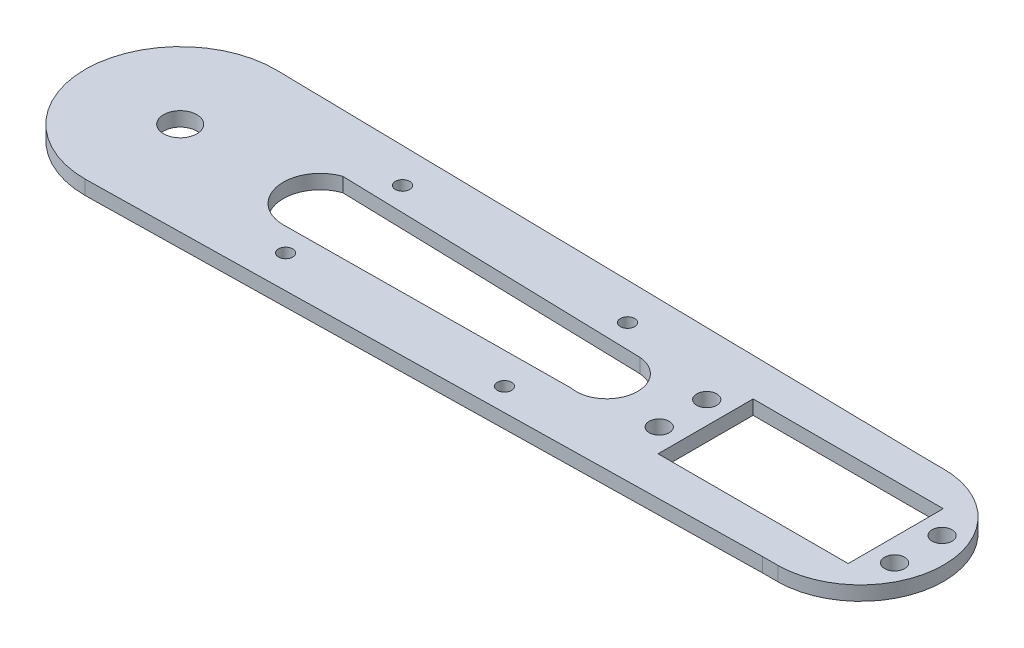
ISO-10303-21;
HEADER;
FILE_DESCRIPTION(('STEP AP214'),'2;1');
FILE_NAME('part.step','',(''),(''),'','','');
FILE_SCHEMA(('AUTOMOTIVE_DESIGN { 1 0 10303 214 1 1 1 1 }'));
ENDSEC;
DATA;
#1=APPLICATION_CONTEXT('core data for automotive mechanical design processes');
#2=APPLICATION_PROTOCOL_DEFINITION('international standard','automotive_design',2000,#1);
#3=PRODUCT_CONTEXT('',#1,'mechanical');
#4=PRODUCT('Part','Part','',(#3));
#5=PRODUCT_RELATED_PRODUCT_CATEGORY('part','',(#4));
#6=PRODUCT_DEFINITION_FORMATION('','',#4);
#7=PRODUCT_DEFINITION_CONTEXT('part definition',#1,'design');
#8=PRODUCT_DEFINITION('design','',#6,#7);
#9=PRODUCT_DEFINITION_SHAPE('','',#8);
#10=(LENGTH_UNIT() NAMED_UNIT(*) SI_UNIT(.MILLI.,.METRE.));
#11=(NAMED_UNIT(*) PLANE_ANGLE_UNIT() SI_UNIT($,.RADIAN.));
#12=(NAMED_UNIT(*) SI_UNIT($,.STERADIAN.) SOLID_ANGLE_UNIT());
#13=UNCERTAINTY_MEASURE_WITH_UNIT(LENGTH_MEASURE(1.E-05),#10,'distance_accuracy_value','');
#14=(GEOMETRIC_REPRESENTATION_CONTEXT(3) GLOBAL_UNCERTAINTY_ASSIGNED_CONTEXT((#13)) GLOBAL_UNIT_ASSIGNED_CONTEXT((#10,
#11,#12)) REPRESENTATION_CONTEXT('',''));
#15=CARTESIAN_POINT('',(0.,0.,0.));
#16=DIRECTION('',(0.,0.,1.));
#17=DIRECTION('',(1.,0.,0.));
#18=AXIS2_PLACEMENT_3D('',#15,#16,#17);
#19=CARTESIAN_POINT('',(0.,3.,0.));
#20=DIRECTION('',(0.,1.,0.));
#21=DIRECTION('',(0.,0.,1.));
#22=AXIS2_PLACEMENT_3D('',#19,#20,#21);
#23=PLANE('',#22);
#24=CARTESIAN_POINT('',(155.08,3.,4.77806502659532));
#25=DIRECTION('',(0.,1.,0.));
#26=DIRECTION('',(0.,0.,1.));
#27=AXIS2_PLACEMENT_3D('',#24,#25,#26);
#28=CIRCLE('',#27,2.09999999999999);
#29=CARTESIAN_POINT('',(155.08,3.,6.87806502659531));
#30=VERTEX_POINT('',#29);
#31=EDGE_CURVE('E360',#30,#30,#28,.T.);
#32=ORIENTED_EDGE('',*,*,#31,.F.);
#33=EDGE_LOOP('',(#32));
#34=FACE_BOUND('',#33,.T.);
#35=CARTESIAN_POINT('',(155.08,3.,-5.22193497340468));
#36=DIRECTION('',(0.,1.,0.));
#37=DIRECTION('',(0.,0.,1.));
#38=AXIS2_PLACEMENT_3D('',#35,#36,#37);
#39=CIRCLE('',#38,2.09999999999999);
#40=CARTESIAN_POINT('',(155.08,3.,-3.12193497340469));
#41=VERTEX_POINT('',#40);
#42=EDGE_CURVE('E364',#41,#41,#39,.T.);
#43=ORIENTED_EDGE('',*,*,#42,.F.);
#44=EDGE_LOOP('',(#43));
#45=FACE_BOUND('',#44,.T.);
#46=DIRECTION('',(-0.999840599345445,0.,0.0178542964168829));
#47=VECTOR('',#46,1.);
#48=CARTESIAN_POINT('',(0.357029008606949,3.,19.9936244819892));
#49=LINE('',#48,#47);
#50=CARTESIAN_POINT('',(140.,3.,17.5));
#51=VERTEX_POINT('',#50);
#52=CARTESIAN_POINT('',(0.,3.,20.));
#53=VERTEX_POINT('',#52);
#54=EDGE_CURVE('E187',#51,#53,#49,.T.);
#55=ORIENTED_EDGE('',*,*,#54,.F.);
#56=DIRECTION('',(-1.,0.,0.));
#57=VECTOR('',#56,1.);
#58=CARTESIAN_POINT('',(0.,3.,17.5000000000002));
#59=LINE('',#58,#57);
#60=CARTESIAN_POINT('',(143.30110747715,3.,17.5));
#61=VERTEX_POINT('',#60);
#62=EDGE_CURVE('E175',#61,#51,#59,.T.);
#63=ORIENTED_EDGE('',*,*,#62,.F.);
#64=CARTESIAN_POINT('',(143.13337203176,3.,0.000803880738995593));
#65=DIRECTION('',(0.,1.,0.));
#66=DIRECTION('',(0.,0.,1.));
#67=AXIS2_PLACEMENT_3D('',#64,#65,#66);
#68=CIRCLE('',#67,17.5);
#69=CARTESIAN_POINT('',(142.869697489549,3.,-17.4972095989618));
#70=VERTEX_POINT('',#69);
#71=EDGE_CURVE('E713',#70,#61,#68,.F.);
#72=ORIENTED_EDGE('',*,*,#71,.F.);
#73=DIRECTION('',(1.,0.,0.));
#74=VECTOR('',#73,1.);
#75=CARTESIAN_POINT('',(0.,3.,-17.4972095989618));
#76=LINE('',#75,#74);
#77=CARTESIAN_POINT('',(140.3125,3.,-17.4972095989618));
#78=VERTEX_POINT('',#77);
#79=EDGE_CURVE('E170',#78,#70,#76,.T.);
#80=ORIENTED_EDGE('',*,*,#79,.F.);
#81=DIRECTION('',(0.999840548512101,0.,0.0178571428571428));
#82=VECTOR('',#81,1.);
#83=CARTESIAN_POINT('',(0.357142857142856,3.,-19.996810970242));
#84=LINE('',#83,#82);
#85=CARTESIAN_POINT('',(0.357142857142857,3.,-19.996810970242));
#86=VERTEX_POINT('',#85);
#87=EDGE_CURVE('E177',#86,#78,#84,.T.);
#88=ORIENTED_EDGE('',*,*,#87,.F.);
#89=CARTESIAN_POINT('',(0.,3.,0.));
#90=DIRECTION('',(0.,1.,0.));
#91=DIRECTION('',(0.,0.,1.));
#92=AXIS2_PLACEMENT_3D('',#89,#90,#91);
#93=CIRCLE('',#92,20.);
#94=EDGE_CURVE('E198',#86,#53,#93,.T.);
#95=ORIENTED_EDGE('',*,*,#94,.T.);
#96=EDGE_LOOP('',(#55,#63,#72,#80,#88,#95));
#97=FACE_BOUND('',#96,.T.);
#98=CARTESIAN_POINT('',(105.56,3.,-5.22193497340468));
#99=DIRECTION('',(0.,1.,0.));
#100=DIRECTION('',(0.,0.,-1.));
#101=AXIS2_PLACEMENT_3D('',#98,#99,#100);
#102=CIRCLE('',#101,2.09999999999999);
#103=CARTESIAN_POINT('',(105.56,3.,-7.32193497340467));
#104=VERTEX_POINT('',#103);
#105=EDGE_CURVE('E369',#104,#104,#102,.T.);
#106=ORIENTED_EDGE('',*,*,#105,.F.);
#107=EDGE_LOOP('',(#106));
#108=FACE_BOUND('',#107,.T.);
#109=CARTESIAN_POINT('',(105.56,3.,4.77806502659531));
#110=DIRECTION('',(0.,1.,0.));
#111=DIRECTION('',(0.,0.,-1.));
#112=AXIS2_PLACEMENT_3D('',#109,#110,#111);
#113=CIRCLE('',#112,2.09999999999999);
#114=CARTESIAN_POINT('',(105.56,3.,2.67806502659532));
#115=VERTEX_POINT('',#114);
#116=EDGE_CURVE('E373',#115,#115,#113,.T.);
#117=ORIENTED_EDGE('',*,*,#116,.F.);
#118=EDGE_LOOP('',(#117));
#119=FACE_BOUND('',#118,.T.);
#120=DIRECTION('',(0.,0.,-1.));
#121=VECTOR('',#120,1.);
#122=CARTESIAN_POINT('',(150.32,3.,-10.2219349734047));
#123=LINE('',#122,#121);
#124=CARTESIAN_POINT('',(150.32,3.,9.77806502659532));
#125=VERTEX_POINT('',#124);
#126=CARTESIAN_POINT('',(150.32,3.,-10.2219349734047));
#127=VERTEX_POINT('',#126);
#128=EDGE_CURVE('E58',#125,#127,#123,.T.);
#129=ORIENTED_EDGE('',*,*,#128,.F.);
#130=DIRECTION('',(1.,0.,0.));
#131=VECTOR('',#130,1.);
#132=CARTESIAN_POINT('',(150.32,3.,9.77806502659532));
#133=LINE('',#132,#131);
#134=CARTESIAN_POINT('',(110.32,3.,9.77806502659532));
#135=VERTEX_POINT('',#134);
#136=EDGE_CURVE('E737',#135,#125,#133,.T.);
#137=ORIENTED_EDGE('',*,*,#136,.F.);
#138=DIRECTION('',(0.,0.,1.));
#139=VECTOR('',#138,1.);
#140=CARTESIAN_POINT('',(110.32,3.,-10.2219349734047));
#141=LINE('',#140,#139);
#142=CARTESIAN_POINT('',(110.32,3.,-10.2219349734047));
#143=VERTEX_POINT('',#142);
#144=EDGE_CURVE('E733',#143,#135,#141,.T.);
#145=ORIENTED_EDGE('',*,*,#144,.F.);
#146=DIRECTION('',(-1.,0.,0.));
#147=VECTOR('',#146,1.);
#148=CARTESIAN_POINT('',(150.32,3.,-10.2219349734047));
#149=LINE('',#148,#147);
#150=EDGE_CURVE('E730',#127,#143,#149,.T.);
#151=ORIENTED_EDGE('',*,*,#150,.F.);
#152=EDGE_LOOP('',(#129,#137,#145,#151));
#153=FACE_BOUND('',#152,.T.);
#154=CARTESIAN_POINT('',(83.1945600648679,3.,-10.9224438629721));
#155=DIRECTION('',(0.,1.,0.));
#156=DIRECTION('',(0.,0.,-1.));
#157=AXIS2_PLACEMENT_3D('',#154,#155,#156);
#158=CIRCLE('',#157,1.5);
#159=CARTESIAN_POINT('',(83.1945600648679,3.,-12.4224438629721));
#160=VERTEX_POINT('',#159);
#161=EDGE_CURVE('E253',#160,#160,#158,.T.);
#162=ORIENTED_EDGE('',*,*,#161,.F.);
#163=EDGE_LOOP('',(#162));
#164=FACE_BOUND('',#163,.T.);
#165=CARTESIAN_POINT('',(81.8715113944771,3.,13.6467101056128));
#166=DIRECTION('',(0.,1.,0.));
#167=DIRECTION('',(0.,0.,-1.));
#168=AXIS2_PLACEMENT_3D('',#165,#166,#167);
#169=CIRCLE('',#168,1.5);
#170=CARTESIAN_POINT('',(81.8715113944771,3.,12.1467101056128));
#171=VERTEX_POINT('',#170);
#172=EDGE_CURVE('E271',#171,#171,#169,.T.);
#173=ORIENTED_EDGE('',*,*,#172,.F.);
#174=EDGE_LOOP('',(#173));
#175=FACE_BOUND('',#174,.T.);
#176=CARTESIAN_POINT('',(34.5416560076669,3.,12.373276524336));
#177=DIRECTION('',(0.,1.,0.));
#178=DIRECTION('',(0.,0.,1.));
#179=AXIS2_PLACEMENT_3D('',#176,#177,#178);
#180=CIRCLE('',#179,1.5);
#181=CARTESIAN_POINT('',(34.5416560076669,3.,13.873276524336));
#182=VERTEX_POINT('',#181);
#183=EDGE_CURVE('E267',#182,#182,#180,.T.);
#184=ORIENTED_EDGE('',*,*,#183,.F.);
#185=EDGE_LOOP('',(#184));
#186=FACE_BOUND('',#185,.T.);
#187=CARTESIAN_POINT('',(34.5416560076669,3.,-12.2314747346436));
#188=DIRECTION('',(0.,1.,0.));
#189=DIRECTION('',(0.,0.,1.));
#190=AXIS2_PLACEMENT_3D('',#187,#188,#189);
#191=CIRCLE('',#190,1.5);
#192=CARTESIAN_POINT('',(34.5416560076669,3.,-10.7314747346435));
#193=VERTEX_POINT('',#192);
#194=EDGE_CURVE('E223',#193,#193,#191,.T.);
#195=ORIENTED_EDGE('',*,*,#194,.F.);
#196=EDGE_LOOP('',(#195));
#197=FACE_BOUND('',#196,.T.);
#198=CARTESIAN_POINT('',(0.,3.,0.));
#199=DIRECTION('',(0.,1.,0.));
#200=DIRECTION('',(0.,0.,1.));
#201=AXIS2_PLACEMENT_3D('',#198,#199,#200);
#202=CIRCLE('',#201,3.5);
#203=CARTESIAN_POINT('',(0.,3.,3.5));
#204=VERTEX_POINT('',#203);
#205=EDGE_CURVE('E204',#204,#204,#202,.T.);
#206=ORIENTED_EDGE('',*,*,#205,.F.);
#207=EDGE_LOOP('',(#206));
#208=FACE_BOUND('',#207,.T.);
#209=DIRECTION('',(-0.999638243342078,0.,-0.0268957700757129));
#210=VECTOR('',#209,1.);
#211=CARTESIAN_POINT('',(0.224031463343584,3.,-8.32660369417584));
#212=LINE('',#211,#210);
#213=CARTESIAN_POINT('',(90.892175895438,3.,-5.88713163307877));
#214=VERTEX_POINT('',#213);
#215=CARTESIAN_POINT('',(26.584417601869,3.,-7.61736423739149));
#216=VERTEX_POINT('',#215);
#217=EDGE_CURVE('E300',#214,#216,#212,.T.);
#218=ORIENTED_EDGE('',*,*,#217,.F.);
#219=CARTESIAN_POINT('',(90.3240104766725,3.,0.57112793676746));
#220=DIRECTION('',(0.,1.,0.));
#221=DIRECTION('',(0.,0.,1.));
#222=AXIS2_PLACEMENT_3D('',#219,#220,#221);
#223=CIRCLE('',#222,6.4832035765192);
#224=CARTESIAN_POINT('',(89.1575998035354,3.,6.94854236239352));
#225=VERTEX_POINT('',#224);
#226=EDGE_CURVE('E234',#214,#225,#223,.F.);
#227=ORIENTED_EDGE('',*,*,#226,.T.);
#228=DIRECTION('',(0.999961154103119,0.,-0.00881420925311579));
#229=VECTOR('',#228,1.);
#230=CARTESIAN_POINT('',(0.068170206551163,3.,7.73382574213925));
#231=LINE('',#230,#229);
#232=CARTESIAN_POINT('',(29.1575998035354,3.,7.47741546213036));
#233=VERTEX_POINT('',#232);
#234=EDGE_CURVE('E285',#233,#225,#231,.T.);
#235=ORIENTED_EDGE('',*,*,#234,.F.);
#236=CARTESIAN_POINT('',(29.1653222501695,3.,-0.290613883536413));
#237=DIRECTION('',(0.,1.,0.));
#238=DIRECTION('',(0.,0.,1.));
#239=AXIS2_PLACEMENT_3D('',#236,#237,#238);
#240=CIRCLE('',#239,7.76803318423193);
#241=EDGE_CURVE('E304',#216,#233,#240,.T.);
#242=ORIENTED_EDGE('',*,*,#241,.F.);
#243=EDGE_LOOP('',(#218,#227,#235,#242));
#244=FACE_BOUND('',#243,.T.);
#245=ADVANCED_FACE('F41',(#34,#45,#97,#108,#119,#153,#164,#175,#186,#197,#208,#244),#23,.T.);
#246=CARTESIAN_POINT('',(0.,0.,0.));
#247=DIRECTION('',(0.,1.,0.));
#248=DIRECTION('',(0.,0.,1.));
#249=AXIS2_PLACEMENT_3D('',#246,#247,#248);
#250=PLANE('',#249);
#251=CARTESIAN_POINT('',(155.08,0.,4.77806502659532));
#252=DIRECTION('',(0.,1.,0.));
#253=DIRECTION('',(0.,0.,1.));
#254=AXIS2_PLACEMENT_3D('',#251,#252,#253);
#255=CIRCLE('',#254,2.09999999999999);
#256=CARTESIAN_POINT('',(155.08,0.,6.87806502659531));
#257=VERTEX_POINT('',#256);
#258=EDGE_CURVE('E247',#257,#257,#255,.T.);
#259=ORIENTED_EDGE('',*,*,#258,.T.);
#260=EDGE_LOOP('',(#259));
#261=FACE_BOUND('',#260,.T.);
#262=CARTESIAN_POINT('',(155.08,0.,-5.22193497340468));
#263=DIRECTION('',(0.,1.,0.));
#264=DIRECTION('',(0.,0.,1.));
#265=AXIS2_PLACEMENT_3D('',#262,#263,#264);
#266=CIRCLE('',#265,2.09999999999999);
#267=CARTESIAN_POINT('',(155.08,0.,-3.12193497340469));
#268=VERTEX_POINT('',#267);
#269=EDGE_CURVE('E256',#268,#268,#266,.T.);
#270=ORIENTED_EDGE('',*,*,#269,.T.);
#271=EDGE_LOOP('',(#270));
#272=FACE_BOUND('',#271,.T.);
#273=DIRECTION('',(-1.,0.,0.));
#274=VECTOR('',#273,1.);
#275=CARTESIAN_POINT('',(0.,0.,17.5000000000002));
#276=LINE('',#275,#274);
#277=CARTESIAN_POINT('',(143.30110747715,0.,17.5));
#278=VERTEX_POINT('',#277);
#279=CARTESIAN_POINT('',(140.,0.,17.5));
#280=VERTEX_POINT('',#279);
#281=EDGE_CURVE('E161',#278,#280,#276,.T.);
#282=ORIENTED_EDGE('',*,*,#281,.T.);
#283=DIRECTION('',(-0.999840599345445,0.,0.0178542964168829));
#284=VECTOR('',#283,1.);
#285=CARTESIAN_POINT('',(0.357029008606949,0.,19.9936244819892));
#286=LINE('',#285,#284);
#287=CARTESIAN_POINT('',(0.,0.,20.));
#288=VERTEX_POINT('',#287);
#289=EDGE_CURVE('E144',#280,#288,#286,.T.);
#290=ORIENTED_EDGE('',*,*,#289,.T.);
#291=CARTESIAN_POINT('',(0.,0.,0.));
#292=DIRECTION('',(0.,1.,0.));
#293=DIRECTION('',(0.,0.,1.));
#294=AXIS2_PLACEMENT_3D('',#291,#292,#293);
#295=CIRCLE('',#294,20.);
#296=CARTESIAN_POINT('',(0.357142857142857,0.,-19.996810970242));
#297=VERTEX_POINT('',#296);
#298=EDGE_CURVE('E195',#297,#288,#295,.T.);
#299=ORIENTED_EDGE('',*,*,#298,.F.);
#300=DIRECTION('',(0.999840548512101,0.,0.0178571428571428));
#301=VECTOR('',#300,1.);
#302=CARTESIAN_POINT('',(0.357142857142856,0.,-19.996810970242));
#303=LINE('',#302,#301);
#304=CARTESIAN_POINT('',(140.3125,0.,-17.4972095989618));
#305=VERTEX_POINT('',#304);
#306=EDGE_CURVE('E157',#297,#305,#303,.T.);
#307=ORIENTED_EDGE('',*,*,#306,.T.);
#308=DIRECTION('',(1.,0.,0.));
#309=VECTOR('',#308,1.);
#310=CARTESIAN_POINT('',(0.,0.,-17.4972095989618));
#311=LINE('',#310,#309);
#312=CARTESIAN_POINT('',(142.869697489549,0.,-17.4972095989618));
#313=VERTEX_POINT('',#312);
#314=EDGE_CURVE('E700',#305,#313,#311,.T.);
#315=ORIENTED_EDGE('',*,*,#314,.T.);
#316=CARTESIAN_POINT('',(143.13337203176,0.,0.000803880738995593));
#317=DIRECTION('',(0.,1.,0.));
#318=DIRECTION('',(0.,0.,1.));
#319=AXIS2_PLACEMENT_3D('',#316,#317,#318);
#320=CIRCLE('',#319,17.5);
#321=EDGE_CURVE('E165',#313,#278,#320,.F.);
#322=ORIENTED_EDGE('',*,*,#321,.T.);
#323=EDGE_LOOP('',(#282,#290,#299,#307,#315,#322));
#324=FACE_BOUND('',#323,.T.);
#325=CARTESIAN_POINT('',(105.56,0.,-5.22193497340468));
#326=DIRECTION('',(0.,1.,0.));
#327=DIRECTION('',(0.,0.,1.));
#328=AXIS2_PLACEMENT_3D('',#325,#326,#327);
#329=CIRCLE('',#328,2.09999999999999);
#330=CARTESIAN_POINT('',(105.56,0.,-3.12193497340469));
#331=VERTEX_POINT('',#330);
#332=EDGE_CURVE('E44',#331,#331,#329,.T.);
#333=ORIENTED_EDGE('',*,*,#332,.T.);
#334=EDGE_LOOP('',(#333));
#335=FACE_BOUND('',#334,.T.);
#336=CARTESIAN_POINT('',(105.56,0.,4.77806502659531));
#337=DIRECTION('',(0.,1.,0.));
#338=DIRECTION('',(0.,0.,1.));
#339=AXIS2_PLACEMENT_3D('',#336,#337,#338);
#340=CIRCLE('',#339,2.09999999999999);
#341=CARTESIAN_POINT('',(105.56,0.,6.8780650265953));
#342=VERTEX_POINT('',#341);
#343=EDGE_CURVE('E244',#342,#342,#340,.T.);
#344=ORIENTED_EDGE('',*,*,#343,.T.);
#345=EDGE_LOOP('',(#344));
#346=FACE_BOUND('',#345,.T.);
#347=DIRECTION('',(1.,0.,0.));
#348=VECTOR('',#347,1.);
#349=CARTESIAN_POINT('',(0.,0.,9.77806502659534));
#350=LINE('',#349,#348);
#351=CARTESIAN_POINT('',(110.32,0.,9.77806502659532));
#352=VERTEX_POINT('',#351);
#353=CARTESIAN_POINT('',(150.32,0.,9.77806502659532));
#354=VERTEX_POINT('',#353);
#355=EDGE_CURVE('E50',#352,#354,#350,.T.);
#356=ORIENTED_EDGE('',*,*,#355,.T.);
#357=DIRECTION('',(0.,0.,-1.));
#358=VECTOR('',#357,1.);
#359=CARTESIAN_POINT('',(150.32,0.,0.));
#360=LINE('',#359,#358);
#361=CARTESIAN_POINT('',(150.32,0.,-10.2219349734047));
#362=VERTEX_POINT('',#361);
#363=EDGE_CURVE('E11',#354,#362,#360,.T.);
#364=ORIENTED_EDGE('',*,*,#363,.T.);
#365=DIRECTION('',(-1.,0.,0.));
#366=VECTOR('',#365,1.);
#367=CARTESIAN_POINT('',(0.,0.,-10.2219349734047));
#368=LINE('',#367,#366);
#369=CARTESIAN_POINT('',(110.32,0.,-10.2219349734047));
#370=VERTEX_POINT('',#369);
#371=EDGE_CURVE('E214',#362,#370,#368,.T.);
#372=ORIENTED_EDGE('',*,*,#371,.T.);
#373=DIRECTION('',(0.,0.,1.));
#374=VECTOR('',#373,1.);
#375=CARTESIAN_POINT('',(110.32,0.,0.));
#376=LINE('',#375,#374);
#377=EDGE_CURVE('E238',#370,#352,#376,.T.);
#378=ORIENTED_EDGE('',*,*,#377,.T.);
#379=EDGE_LOOP('',(#356,#364,#372,#378));
#380=FACE_BOUND('',#379,.T.);
#381=CARTESIAN_POINT('',(83.1945600648679,0.,-10.9224438629721));
#382=DIRECTION('',(0.,1.,0.));
#383=DIRECTION('',(0.,0.,1.));
#384=AXIS2_PLACEMENT_3D('',#381,#382,#383);
#385=CIRCLE('',#384,1.5);
#386=CARTESIAN_POINT('',(83.1945600648679,0.,-9.4224438629721));
#387=VERTEX_POINT('',#386);
#388=EDGE_CURVE('E231',#387,#387,#385,.T.);
#389=ORIENTED_EDGE('',*,*,#388,.T.);
#390=EDGE_LOOP('',(#389));
#391=FACE_BOUND('',#390,.T.);
#392=CARTESIAN_POINT('',(81.8715113944771,0.,13.6467101056128));
#393=DIRECTION('',(0.,1.,0.));
#394=DIRECTION('',(0.,0.,1.));
#395=AXIS2_PLACEMENT_3D('',#392,#393,#394);
#396=CIRCLE('',#395,1.5);
#397=CARTESIAN_POINT('',(81.8715113944771,0.,15.1467101056128));
#398=VERTEX_POINT('',#397);
#399=EDGE_CURVE('E227',#398,#398,#396,.T.);
#400=ORIENTED_EDGE('',*,*,#399,.T.);
#401=EDGE_LOOP('',(#400));
#402=FACE_BOUND('',#401,.T.);
#403=CARTESIAN_POINT('',(34.5416560076669,0.,12.373276524336));
#404=DIRECTION('',(0.,1.,0.));
#405=DIRECTION('',(0.,0.,1.));
#406=AXIS2_PLACEMENT_3D('',#403,#404,#405);
#407=CIRCLE('',#406,1.5);
#408=CARTESIAN_POINT('',(34.5416560076669,0.,13.873276524336));
#409=VERTEX_POINT('',#408);
#410=EDGE_CURVE('E222',#409,#409,#407,.T.);
#411=ORIENTED_EDGE('',*,*,#410,.T.);
#412=EDGE_LOOP('',(#411));
#413=FACE_BOUND('',#412,.T.);
#414=CARTESIAN_POINT('',(34.5416560076669,0.,-12.2314747346436));
#415=DIRECTION('',(0.,1.,0.));
#416=DIRECTION('',(0.,0.,1.));
#417=AXIS2_PLACEMENT_3D('',#414,#415,#416);
#418=CIRCLE('',#417,1.5);
#419=CARTESIAN_POINT('',(34.5416560076669,0.,-10.7314747346435));
#420=VERTEX_POINT('',#419);
#421=EDGE_CURVE('E218',#420,#420,#418,.T.);
#422=ORIENTED_EDGE('',*,*,#421,.T.);
#423=EDGE_LOOP('',(#422));
#424=FACE_BOUND('',#423,.T.);
#425=CARTESIAN_POINT('',(0.,0.,0.));
#426=DIRECTION('',(0.,1.,0.));
#427=DIRECTION('',(0.,0.,1.));
#428=AXIS2_PLACEMENT_3D('',#425,#426,#427);
#429=CIRCLE('',#428,3.5);
#430=CARTESIAN_POINT('',(0.,0.,3.5));
#431=VERTEX_POINT('',#430);
#432=EDGE_CURVE('E158',#431,#431,#429,.T.);
#433=ORIENTED_EDGE('',*,*,#432,.T.);
#434=EDGE_LOOP('',(#433));
#435=FACE_BOUND('',#434,.T.);
#436=CARTESIAN_POINT('',(90.3240104766725,0.,0.57112793676746));
#437=DIRECTION('',(0.,1.,0.));
#438=DIRECTION('',(0.,0.,1.));
#439=AXIS2_PLACEMENT_3D('',#436,#437,#438);
#440=CIRCLE('',#439,6.4832035765192);
#441=CARTESIAN_POINT('',(90.892175895438,0.,-5.88713163307878));
#442=VERTEX_POINT('',#441);
#443=CARTESIAN_POINT('',(89.1575998035354,0.,6.94854236239352));
#444=VERTEX_POINT('',#443);
#445=EDGE_CURVE('E281',#442,#444,#440,.F.);
#446=ORIENTED_EDGE('',*,*,#445,.F.);
#447=DIRECTION('',(-0.999638243342078,0.,-0.0268957700757129));
#448=VECTOR('',#447,1.);
#449=CARTESIAN_POINT('',(0.224031463343584,0.,-8.32660369417584));
#450=LINE('',#449,#448);
#451=CARTESIAN_POINT('',(26.584417601869,0.,-7.61736423739149));
#452=VERTEX_POINT('',#451);
#453=EDGE_CURVE('E284',#442,#452,#450,.T.);
#454=ORIENTED_EDGE('',*,*,#453,.T.);
#455=CARTESIAN_POINT('',(29.1653222501695,0.,-0.290613883536413));
#456=DIRECTION('',(0.,1.,0.));
#457=DIRECTION('',(0.,0.,1.));
#458=AXIS2_PLACEMENT_3D('',#455,#456,#457);
#459=CIRCLE('',#458,7.76803318423193);
#460=CARTESIAN_POINT('',(29.1575998035354,0.,7.47741546213036));
#461=VERTEX_POINT('',#460);
#462=EDGE_CURVE('E289',#452,#461,#459,.T.);
#463=ORIENTED_EDGE('',*,*,#462,.T.);
#464=DIRECTION('',(0.999961154103119,0.,-0.00881420925311579));
#465=VECTOR('',#464,1.);
#466=CARTESIAN_POINT('',(0.068170206551163,0.,7.73382574213925));
#467=LINE('',#466,#465);
#468=EDGE_CURVE('E293',#461,#444,#467,.T.);
#469=ORIENTED_EDGE('',*,*,#468,.T.);
#470=EDGE_LOOP('',(#446,#454,#463,#469));
#471=FACE_BOUND('',#470,.T.);
#472=ADVANCED_FACE('F162',(#261,#272,#324,#335,#346,#380,#391,#402,#413,#424,#435,#471),#250,.F.);
#473=CARTESIAN_POINT('',(0.357029008606949,3.,19.9936244819892));
#474=DIRECTION('',(0.0178542964168829,0.,0.999840599345445));
#475=DIRECTION('',(0.999840599345445,0.,-0.0178542964168829));
#476=AXIS2_PLACEMENT_3D('',#473,#474,#475);
#477=PLANE('',#476);
#478=ORIENTED_EDGE('',*,*,#289,.F.);
#479=DIRECTION('',(0.,-1.,0.));
#480=VECTOR('',#479,1.);
#481=CARTESIAN_POINT('',(140.,3.,17.5));
#482=LINE('',#481,#480);
#483=EDGE_CURVE('E149',#51,#280,#482,.T.);
#484=ORIENTED_EDGE('',*,*,#483,.F.);
#485=ORIENTED_EDGE('',*,*,#54,.T.);
#486=DIRECTION('',(0.,-1.,0.));
#487=VECTOR('',#486,1.);
#488=CARTESIAN_POINT('',(0.,3.,20.));
#489=LINE('',#488,#487);
#490=EDGE_CURVE('E152',#53,#288,#489,.T.);
#491=ORIENTED_EDGE('',*,*,#490,.T.);
#492=EDGE_LOOP('',(#478,#484,#485,#491));
#493=FACE_BOUND('',#492,.T.);
#494=ADVANCED_FACE('F146',(#493),#477,.T.);
#495=CARTESIAN_POINT('',(0.357142857142856,3.,-19.996810970242));
#496=DIRECTION('',(0.0178571428571428,0.,-0.999840548512101));
#497=DIRECTION('',(-0.999840548512101,0.,-0.0178571428571428));
#498=AXIS2_PLACEMENT_3D('',#495,#496,#497);
#499=PLANE('',#498);
#500=ORIENTED_EDGE('',*,*,#306,.F.);
#501=DIRECTION('',(0.,-1.,0.));
#502=VECTOR('',#501,1.);
#503=CARTESIAN_POINT('',(0.357142857142857,3.,-19.996810970242));
#504=LINE('',#503,#502);
#505=EDGE_CURVE('E196',#86,#297,#504,.T.);
#506=ORIENTED_EDGE('',*,*,#505,.F.);
#507=ORIENTED_EDGE('',*,*,#87,.T.);
#508=DIRECTION('',(0.,-1.,0.));
#509=VECTOR('',#508,1.);
#510=CARTESIAN_POINT('',(140.3125,3.,-17.4972095989618));
#511=LINE('',#510,#509);
#512=EDGE_CURVE('E184',#78,#305,#511,.T.);
#513=ORIENTED_EDGE('',*,*,#512,.T.);
#514=EDGE_LOOP('',(#500,#506,#507,#513));
#515=FACE_BOUND('',#514,.T.);
#516=ADVANCED_FACE('F539',(#515),#499,.T.);
#517=CARTESIAN_POINT('',(0.,3.,0.));
#518=DIRECTION('',(0.,-1.,0.));
#519=DIRECTION('',(0.,0.,-1.));
#520=AXIS2_PLACEMENT_3D('',#517,#518,#519);
#521=CYLINDRICAL_SURFACE('',#520,20.);
#522=ORIENTED_EDGE('',*,*,#298,.T.);
#523=ORIENTED_EDGE('',*,*,#490,.F.);
#524=ORIENTED_EDGE('',*,*,#94,.F.);
#525=ORIENTED_EDGE('',*,*,#505,.T.);
#526=EDGE_LOOP('',(#522,#523,#524,#525));
#527=FACE_BOUND('',#526,.T.);
#528=ADVANCED_FACE('F347',(#527),#521,.T.);
#529=CARTESIAN_POINT('',(0.,0.,0.));
#530=DIRECTION('',(0.,1.,0.));
#531=DIRECTION('',(0.,0.,1.));
#532=AXIS2_PLACEMENT_3D('',#529,#530,#531);
#533=CYLINDRICAL_SURFACE('',#532,3.5);
#534=ORIENTED_EDGE('',*,*,#432,.F.);
#535=EDGE_LOOP('',(#534));
#536=FACE_BOUND('',#535,.T.);
#537=ORIENTED_EDGE('',*,*,#205,.T.);
#538=EDGE_LOOP('',(#537));
#539=FACE_BOUND('',#538,.T.);
#540=ADVANCED_FACE('F340',(#536,#539),#533,.F.);
#541=CARTESIAN_POINT('',(90.3240104766725,0.,0.57112793676746));
#542=DIRECTION('',(0.,1.,0.));
#543=DIRECTION('',(0.,0.,1.));
#544=AXIS2_PLACEMENT_3D('',#541,#542,#543);
#545=CYLINDRICAL_SURFACE('',#544,6.4832035765192);
#546=ORIENTED_EDGE('',*,*,#226,.F.);
#547=DIRECTION('',(0.,1.,0.));
#548=VECTOR('',#547,1.);
#549=CARTESIAN_POINT('',(90.892175895438,0.,-5.88713163307878));
#550=LINE('',#549,#548);
#551=EDGE_CURVE('E191',#442,#214,#550,.T.);
#552=ORIENTED_EDGE('',*,*,#551,.F.);
#553=ORIENTED_EDGE('',*,*,#445,.T.);
#554=DIRECTION('',(0.,1.,0.));
#555=VECTOR('',#554,1.);
#556=CARTESIAN_POINT('',(89.1575998035354,0.,6.94854236239352));
#557=LINE('',#556,#555);
#558=EDGE_CURVE('E210',#444,#225,#557,.T.);
#559=ORIENTED_EDGE('',*,*,#558,.T.);
#560=EDGE_LOOP('',(#546,#552,#553,#559));
#561=FACE_BOUND('',#560,.T.);
#562=ADVANCED_FACE('F338',(#561),#545,.F.);
#563=CARTESIAN_POINT('',(0.068170206551163,0.,7.73382574213925));
#564=DIRECTION('',(0.00881420925311579,0.,0.999961154103119));
#565=DIRECTION('',(0.999961154103119,0.,-0.0088142092531158));
#566=AXIS2_PLACEMENT_3D('',#563,#564,#565);
#567=PLANE('',#566);
#568=ORIENTED_EDGE('',*,*,#234,.T.);
#569=ORIENTED_EDGE('',*,*,#558,.F.);
#570=ORIENTED_EDGE('',*,*,#468,.F.);
#571=DIRECTION('',(0.,1.,0.));
#572=VECTOR('',#571,1.);
#573=CARTESIAN_POINT('',(29.1575998035354,0.,7.47741546213036));
#574=LINE('',#573,#572);
#575=EDGE_CURVE('E313',#461,#233,#574,.T.);
#576=ORIENTED_EDGE('',*,*,#575,.T.);
#577=EDGE_LOOP('',(#568,#569,#570,#576));
#578=FACE_BOUND('',#577,.T.);
#579=ADVANCED_FACE('F336',(#578),#567,.F.);
#580=CARTESIAN_POINT('',(29.1653222501695,0.,-0.290613883536413));
#581=DIRECTION('',(0.,1.,0.));
#582=DIRECTION('',(0.,0.,1.));
#583=AXIS2_PLACEMENT_3D('',#580,#581,#582);
#584=CYLINDRICAL_SURFACE('',#583,7.76803318423193);
#585=ORIENTED_EDGE('',*,*,#241,.T.);
#586=ORIENTED_EDGE('',*,*,#575,.F.);
#587=ORIENTED_EDGE('',*,*,#462,.F.);
#588=DIRECTION('',(0.,1.,0.));
#589=VECTOR('',#588,1.);
#590=CARTESIAN_POINT('',(26.584417601869,0.,-7.61736423739149));
#591=LINE('',#590,#589);
#592=EDGE_CURVE('E315',#452,#216,#591,.T.);
#593=ORIENTED_EDGE('',*,*,#592,.T.);
#594=EDGE_LOOP('',(#585,#586,#587,#593));
#595=FACE_BOUND('',#594,.T.);
#596=ADVANCED_FACE('F332',(#595),#584,.F.);
#597=CARTESIAN_POINT('',(0.224031463343584,0.,-8.32660369417584));
#598=DIRECTION('',(0.0268957700757129,0.,-0.999638243342077));
#599=DIRECTION('',(-0.999638243342078,0.,-0.0268957700757129));
#600=AXIS2_PLACEMENT_3D('',#597,#598,#599);
#601=PLANE('',#600);
#602=ORIENTED_EDGE('',*,*,#217,.T.);
#603=ORIENTED_EDGE('',*,*,#592,.F.);
#604=ORIENTED_EDGE('',*,*,#453,.F.);
#605=ORIENTED_EDGE('',*,*,#551,.T.);
#606=EDGE_LOOP('',(#602,#603,#604,#605));
#607=FACE_BOUND('',#606,.T.);
#608=ADVANCED_FACE('F326',(#607),#601,.F.);
#609=CARTESIAN_POINT('',(34.5416560076669,-7.,-12.2314747346436));
#610=DIRECTION('',(0.,1.,0.));
#611=DIRECTION('',(0.,0.,1.));
#612=AXIS2_PLACEMENT_3D('',#609,#610,#611);
#613=CYLINDRICAL_SURFACE('',#612,1.5);
#614=ORIENTED_EDGE('',*,*,#194,.T.);
#615=EDGE_LOOP('',(#614));
#616=FACE_BOUND('',#615,.T.);
#617=ORIENTED_EDGE('',*,*,#421,.F.);
#618=EDGE_LOOP('',(#617));
#619=FACE_BOUND('',#618,.T.);
#620=ADVANCED_FACE('F388',(#616,#619),#613,.F.);
#621=CARTESIAN_POINT('',(34.5416560076669,-7.,12.373276524336));
#622=DIRECTION('',(0.,1.,0.));
#623=DIRECTION('',(0.,0.,1.));
#624=AXIS2_PLACEMENT_3D('',#621,#622,#623);
#625=CYLINDRICAL_SURFACE('',#624,1.5);
#626=ORIENTED_EDGE('',*,*,#183,.T.);
#627=EDGE_LOOP('',(#626));
#628=FACE_BOUND('',#627,.T.);
#629=ORIENTED_EDGE('',*,*,#410,.F.);
#630=EDGE_LOOP('',(#629));
#631=FACE_BOUND('',#630,.T.);
#632=ADVANCED_FACE('F391',(#628,#631),#625,.F.);
#633=CARTESIAN_POINT('',(81.8715113944771,-7.,13.6467101056128));
#634=DIRECTION('',(0.,1.,0.));
#635=DIRECTION('',(0.,0.,1.));
#636=AXIS2_PLACEMENT_3D('',#633,#634,#635);
#637=CYLINDRICAL_SURFACE('',#636,1.5);
#638=ORIENTED_EDGE('',*,*,#172,.T.);
#639=EDGE_LOOP('',(#638));
#640=FACE_BOUND('',#639,.T.);
#641=ORIENTED_EDGE('',*,*,#399,.F.);
#642=EDGE_LOOP('',(#641));
#643=FACE_BOUND('',#642,.T.);
#644=ADVANCED_FACE('F401',(#640,#643),#637,.F.);
#645=CARTESIAN_POINT('',(83.1945600648679,-7.,-10.9224438629721));
#646=DIRECTION('',(0.,1.,0.));
#647=DIRECTION('',(0.,0.,1.));
#648=AXIS2_PLACEMENT_3D('',#645,#646,#647);
#649=CYLINDRICAL_SURFACE('',#648,1.5);
#650=ORIENTED_EDGE('',*,*,#161,.T.);
#651=EDGE_LOOP('',(#650));
#652=FACE_BOUND('',#651,.T.);
#653=ORIENTED_EDGE('',*,*,#388,.F.);
#654=EDGE_LOOP('',(#653));
#655=FACE_BOUND('',#654,.T.);
#656=ADVANCED_FACE('F405',(#652,#655),#649,.F.);
#657=CARTESIAN_POINT('',(155.08,-7.,-5.22193497340468));
#658=DIRECTION('',(0.,1.,0.));
#659=DIRECTION('',(0.,0.,1.));
#660=AXIS2_PLACEMENT_3D('',#657,#658,#659);
#661=CYLINDRICAL_SURFACE('',#660,2.09999999999999);
#662=ORIENTED_EDGE('',*,*,#42,.T.);
#663=EDGE_LOOP('',(#662));
#664=FACE_BOUND('',#663,.T.);
#665=ORIENTED_EDGE('',*,*,#269,.F.);
#666=EDGE_LOOP('',(#665));
#667=FACE_BOUND('',#666,.T.);
#668=ADVANCED_FACE('F516',(#664,#667),#661,.F.);
#669=CARTESIAN_POINT('',(155.08,-7.,4.77806502659532));
#670=DIRECTION('',(0.,1.,0.));
#671=DIRECTION('',(0.,0.,1.));
#672=AXIS2_PLACEMENT_3D('',#669,#670,#671);
#673=CYLINDRICAL_SURFACE('',#672,2.09999999999999);
#674=ORIENTED_EDGE('',*,*,#31,.T.);
#675=EDGE_LOOP('',(#674));
#676=FACE_BOUND('',#675,.T.);
#677=ORIENTED_EDGE('',*,*,#258,.F.);
#678=EDGE_LOOP('',(#677));
#679=FACE_BOUND('',#678,.T.);
#680=ADVANCED_FACE('F511',(#676,#679),#673,.F.);
#681=CARTESIAN_POINT('',(150.32,-7.,-10.2219349734047));
#682=DIRECTION('',(1.,0.,0.));
#683=DIRECTION('',(0.,0.,-1.));
#684=AXIS2_PLACEMENT_3D('',#681,#682,#683);
#685=PLANE('',#684);
#686=DIRECTION('',(0.,1.,0.));
#687=VECTOR('',#686,1.);
#688=CARTESIAN_POINT('',(150.32,-7.,9.77806502659532));
#689=LINE('',#688,#687);
#690=EDGE_CURVE('E263',#354,#125,#689,.T.);
#691=ORIENTED_EDGE('',*,*,#690,.T.);
#692=ORIENTED_EDGE('',*,*,#128,.T.);
#693=DIRECTION('',(0.,1.,0.));
#694=VECTOR('',#693,1.);
#695=CARTESIAN_POINT('',(150.32,-7.,-10.2219349734047));
#696=LINE('',#695,#694);
#697=EDGE_CURVE('E741',#362,#127,#696,.T.);
#698=ORIENTED_EDGE('',*,*,#697,.F.);
#699=ORIENTED_EDGE('',*,*,#363,.F.);
#700=EDGE_LOOP('',(#691,#692,#698,#699));
#701=FACE_BOUND('',#700,.T.);
#702=ADVANCED_FACE('F429',(#701),#685,.F.);
#703=CARTESIAN_POINT('',(150.32,-7.,9.77806502659532));
#704=DIRECTION('',(0.,0.,1.));
#705=DIRECTION('',(1.,0.,0.));
#706=AXIS2_PLACEMENT_3D('',#703,#704,#705);
#707=PLANE('',#706);
#708=DIRECTION('',(0.,1.,0.));
#709=VECTOR('',#708,1.);
#710=CARTESIAN_POINT('',(110.32,-7.,9.77806502659532));
#711=LINE('',#710,#709);
#712=EDGE_CURVE('E744',#352,#135,#711,.T.);
#713=ORIENTED_EDGE('',*,*,#712,.T.);
#714=ORIENTED_EDGE('',*,*,#136,.T.);
#715=ORIENTED_EDGE('',*,*,#690,.F.);
#716=ORIENTED_EDGE('',*,*,#355,.F.);
#717=EDGE_LOOP('',(#713,#714,#715,#716));
#718=FACE_BOUND('',#717,.T.);
#719=ADVANCED_FACE('F423',(#718),#707,.F.);
#720=CARTESIAN_POINT('',(110.32,-7.,-10.2219349734047));
#721=DIRECTION('',(-1.,0.,0.));
#722=DIRECTION('',(0.,0.,1.));
#723=AXIS2_PLACEMENT_3D('',#720,#721,#722);
#724=PLANE('',#723);
#725=DIRECTION('',(0.,1.,0.));
#726=VECTOR('',#725,1.);
#727=CARTESIAN_POINT('',(110.32,-7.,-10.2219349734047));
#728=LINE('',#727,#726);
#729=EDGE_CURVE('E66',#370,#143,#728,.T.);
#730=ORIENTED_EDGE('',*,*,#729,.T.);
#731=ORIENTED_EDGE('',*,*,#144,.T.);
#732=ORIENTED_EDGE('',*,*,#712,.F.);
#733=ORIENTED_EDGE('',*,*,#377,.F.);
#734=EDGE_LOOP('',(#730,#731,#732,#733));
#735=FACE_BOUND('',#734,.T.);
#736=ADVANCED_FACE('F428',(#735),#724,.F.);
#737=CARTESIAN_POINT('',(150.32,-7.,-10.2219349734047));
#738=DIRECTION('',(0.,0.,-1.));
#739=DIRECTION('',(-1.,0.,0.));
#740=AXIS2_PLACEMENT_3D('',#737,#738,#739);
#741=PLANE('',#740);
#742=ORIENTED_EDGE('',*,*,#697,.T.);
#743=ORIENTED_EDGE('',*,*,#150,.T.);
#744=ORIENTED_EDGE('',*,*,#729,.F.);
#745=ORIENTED_EDGE('',*,*,#371,.F.);
#746=EDGE_LOOP('',(#742,#743,#744,#745));
#747=FACE_BOUND('',#746,.T.);
#748=ADVANCED_FACE('F441',(#747),#741,.F.);
#749=CARTESIAN_POINT('',(105.56,-7.,4.77806502659531));
#750=DIRECTION('',(0.,1.,0.));
#751=DIRECTION('',(0.,0.,1.));
#752=AXIS2_PLACEMENT_3D('',#749,#750,#751);
#753=CYLINDRICAL_SURFACE('',#752,2.09999999999999);
#754=ORIENTED_EDGE('',*,*,#116,.T.);
#755=EDGE_LOOP('',(#754));
#756=FACE_BOUND('',#755,.T.);
#757=ORIENTED_EDGE('',*,*,#343,.F.);
#758=EDGE_LOOP('',(#757));
#759=FACE_BOUND('',#758,.T.);
#760=ADVANCED_FACE('F451',(#756,#759),#753,.F.);
#761=CARTESIAN_POINT('',(105.56,-7.,-5.22193497340468));
#762=DIRECTION('',(0.,1.,0.));
#763=DIRECTION('',(0.,0.,1.));
#764=AXIS2_PLACEMENT_3D('',#761,#762,#763);
#765=CYLINDRICAL_SURFACE('',#764,2.09999999999999);
#766=ORIENTED_EDGE('',*,*,#105,.T.);
#767=EDGE_LOOP('',(#766));
#768=FACE_BOUND('',#767,.T.);
#769=ORIENTED_EDGE('',*,*,#332,.F.);
#770=EDGE_LOOP('',(#769));
#771=FACE_BOUND('',#770,.T.);
#772=ADVANCED_FACE('F460',(#768,#771),#765,.F.);
#773=CARTESIAN_POINT('',(0.,0.,-17.4972095989618));
#774=DIRECTION('',(0.,0.,1.));
#775=DIRECTION('',(1.,0.,0.));
#776=AXIS2_PLACEMENT_3D('',#773,#774,#775);
#777=PLANE('',#776);
#778=ORIENTED_EDGE('',*,*,#79,.T.);
#779=DIRECTION('',(0.,1.,0.));
#780=VECTOR('',#779,1.);
#781=CARTESIAN_POINT('',(142.869697489549,0.,-17.4972095989618));
#782=LINE('',#781,#780);
#783=EDGE_CURVE('E701',#313,#70,#782,.T.);
#784=ORIENTED_EDGE('',*,*,#783,.F.);
#785=ORIENTED_EDGE('',*,*,#314,.F.);
#786=ORIENTED_EDGE('',*,*,#512,.F.);
#787=EDGE_LOOP('',(#778,#784,#785,#786));
#788=FACE_BOUND('',#787,.T.);
#789=ADVANCED_FACE('F470',(#788),#777,.F.);
#790=CARTESIAN_POINT('',(143.13337203176,0.,0.000803880738995593));
#791=DIRECTION('',(0.,1.,0.));
#792=DIRECTION('',(0.,0.,1.));
#793=AXIS2_PLACEMENT_3D('',#790,#791,#792);
#794=CYLINDRICAL_SURFACE('',#793,17.5);
#795=ORIENTED_EDGE('',*,*,#71,.T.);
#796=DIRECTION('',(0.,1.,0.));
#797=VECTOR('',#796,1.);
#798=CARTESIAN_POINT('',(143.30110747715,0.,17.5));
#799=LINE('',#798,#797);
#800=EDGE_CURVE('E703',#278,#61,#799,.T.);
#801=ORIENTED_EDGE('',*,*,#800,.F.);
#802=ORIENTED_EDGE('',*,*,#321,.F.);
#803=ORIENTED_EDGE('',*,*,#783,.T.);
#804=EDGE_LOOP('',(#795,#801,#802,#803));
#805=FACE_BOUND('',#804,.T.);
#806=ADVANCED_FACE('F481',(#805),#794,.T.);
#807=CARTESIAN_POINT('',(0.,0.,17.5000000000002));
#808=DIRECTION('',(0.,0.,-1.));
#809=DIRECTION('',(-1.,0.,0.));
#810=AXIS2_PLACEMENT_3D('',#807,#808,#809);
#811=PLANE('',#810);
#812=ORIENTED_EDGE('',*,*,#62,.T.);
#813=ORIENTED_EDGE('',*,*,#483,.T.);
#814=ORIENTED_EDGE('',*,*,#281,.F.);
#815=ORIENTED_EDGE('',*,*,#800,.T.);
#816=EDGE_LOOP('',(#812,#813,#814,#815));
#817=FACE_BOUND('',#816,.T.);
#818=ADVANCED_FACE('F173',(#817),#811,.F.);
#819=CLOSED_SHELL('',(#245,#472,#494,#516,#528,#540,#562,#579,#596,#608,#620,#632,#644,#656,
#668,#680,#702,#719,#736,#748,#760,#772,#789,#806,#818));
#820=MANIFOLD_SOLID_BREP('B2',#819);
#821=ADVANCED_BREP_SHAPE_REPRESENTATION('',(#18,#820),#14);
#822=SHAPE_DEFINITION_REPRESENTATION(#9,#821);
ENDSEC;
END-ISO-10303-21;
